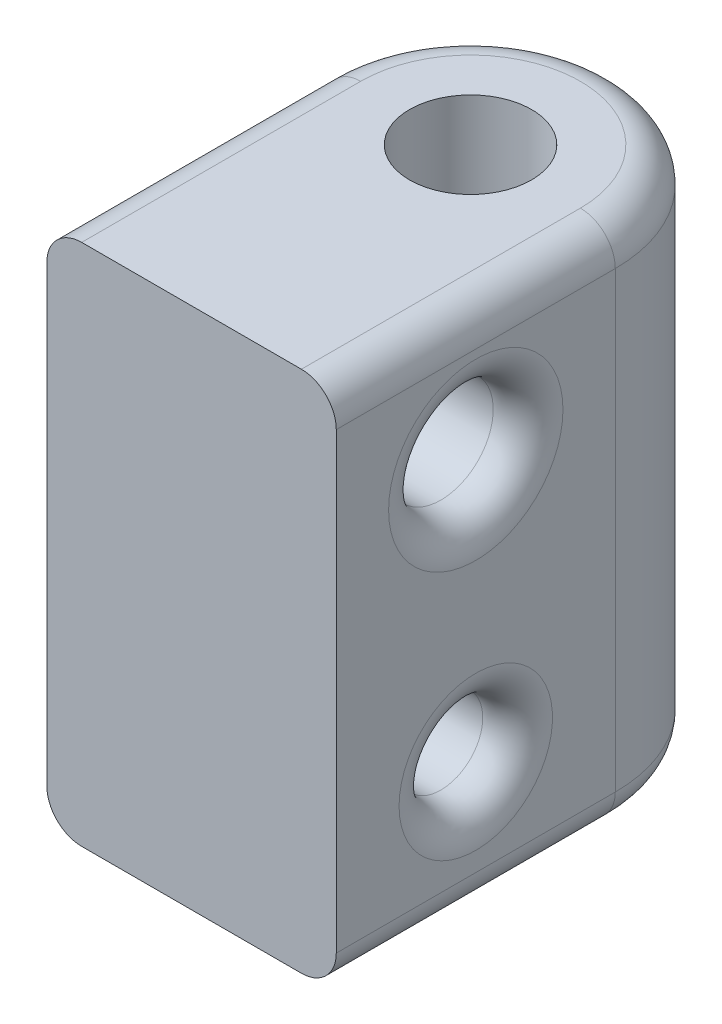
ISO-10303-21;
HEADER;
FILE_DESCRIPTION(('STEP AP214'),'2;1');
FILE_NAME('part.step','',(''),(''),'','','');
FILE_SCHEMA(('AUTOMOTIVE_DESIGN { 1 0 10303 214 1 1 1 1 }'));
ENDSEC;
DATA;
#1=APPLICATION_CONTEXT('core data for automotive mechanical design processes');
#2=APPLICATION_PROTOCOL_DEFINITION('international standard','automotive_design',2000,#1);
#3=PRODUCT_CONTEXT('',#1,'mechanical');
#4=PRODUCT('Part','Part','',(#3));
#5=PRODUCT_RELATED_PRODUCT_CATEGORY('part','',(#4));
#6=PRODUCT_DEFINITION_FORMATION('','',#4);
#7=PRODUCT_DEFINITION_CONTEXT('part definition',#1,'design');
#8=PRODUCT_DEFINITION('design','',#6,#7);
#9=PRODUCT_DEFINITION_SHAPE('','',#8);
#10=(LENGTH_UNIT() NAMED_UNIT(*) SI_UNIT(.MILLI.,.METRE.));
#11=(NAMED_UNIT(*) PLANE_ANGLE_UNIT() SI_UNIT($,.RADIAN.));
#12=(NAMED_UNIT(*) SI_UNIT($,.STERADIAN.) SOLID_ANGLE_UNIT());
#13=UNCERTAINTY_MEASURE_WITH_UNIT(LENGTH_MEASURE(1.E-05),#10,'distance_accuracy_value','');
#14=(GEOMETRIC_REPRESENTATION_CONTEXT(3) GLOBAL_UNCERTAINTY_ASSIGNED_CONTEXT((#13)) GLOBAL_UNIT_ASSIGNED_CONTEXT((#10,
#11,#12)) REPRESENTATION_CONTEXT('',''));
#15=CARTESIAN_POINT('',(0.,0.,0.));
#16=DIRECTION('',(0.,0.,1.));
#17=DIRECTION('',(1.,0.,0.));
#18=AXIS2_PLACEMENT_3D('',#15,#16,#17);
#19=CARTESIAN_POINT('',(0.,7.5,0.));
#20=DIRECTION('',(0.,-1.,0.));
#21=DIRECTION('',(0.,0.,-1.));
#22=AXIS2_PLACEMENT_3D('',#19,#20,#21);
#23=PLANE('',#22);
#24=DIRECTION('',(1.,0.,0.));
#25=VECTOR('',#24,1.);
#26=CARTESIAN_POINT('',(-4.15,7.5,8.));
#27=LINE('',#26,#25);
#28=CARTESIAN_POINT('',(-3.15,7.5,8.));
#29=VERTEX_POINT('',#28);
#30=CARTESIAN_POINT('',(3.15,7.5,8.));
#31=VERTEX_POINT('',#30);
#32=EDGE_CURVE('E107',#29,#31,#27,.T.);
#33=ORIENTED_EDGE('',*,*,#32,.T.);
#34=DIRECTION('',(0.,0.,-1.));
#35=VECTOR('',#34,1.);
#36=CARTESIAN_POINT('',(3.15,7.5,0.));
#37=LINE('',#36,#35);
#38=CARTESIAN_POINT('',(3.15,7.5,0.));
#39=VERTEX_POINT('',#38);
#40=EDGE_CURVE('E115',#31,#39,#37,.T.);
#41=ORIENTED_EDGE('',*,*,#40,.T.);
#42=CARTESIAN_POINT('',(0.,7.5,0.));
#43=DIRECTION('',(0.,-1.,0.));
#44=DIRECTION('',(0.,0.,-1.));
#45=AXIS2_PLACEMENT_3D('',#42,#43,#44);
#46=CIRCLE('',#45,3.15);
#47=CARTESIAN_POINT('',(-3.15,7.5,0.));
#48=VERTEX_POINT('',#47);
#49=EDGE_CURVE('E110',#39,#48,#46,.F.);
#50=ORIENTED_EDGE('',*,*,#49,.T.);
#51=DIRECTION('',(0.,0.,1.));
#52=VECTOR('',#51,1.);
#53=CARTESIAN_POINT('',(-3.15,7.5,0.));
#54=LINE('',#53,#52);
#55=EDGE_CURVE('E103',#48,#29,#54,.T.);
#56=ORIENTED_EDGE('',*,*,#55,.T.);
#57=EDGE_LOOP('',(#33,#41,#50,#56));
#58=FACE_BOUND('',#57,.T.);
#59=CARTESIAN_POINT('',(0.,7.5,0.));
#60=DIRECTION('',(0.,1.,0.));
#61=DIRECTION('',(0.,0.,1.));
#62=AXIS2_PLACEMENT_3D('',#59,#60,#61);
#63=CIRCLE('',#62,1.75);
#64=CARTESIAN_POINT('',(0.,7.5,1.75));
#65=VERTEX_POINT('',#64);
#66=EDGE_CURVE('E220',#65,#65,#63,.T.);
#67=ORIENTED_EDGE('',*,*,#66,.F.);
#68=EDGE_LOOP('',(#67));
#69=FACE_BOUND('',#68,.T.);
#70=ADVANCED_FACE('F37',(#58,#69),#23,.F.);
#71=CARTESIAN_POINT('',(0.,-7.5,0.));
#72=DIRECTION('',(0.,-1.,0.));
#73=DIRECTION('',(0.,0.,-1.));
#74=AXIS2_PLACEMENT_3D('',#71,#72,#73);
#75=PLANE('',#74);
#76=CARTESIAN_POINT('',(0.,-7.5,0.));
#77=DIRECTION('',(0.,-1.,0.));
#78=DIRECTION('',(0.,0.,-1.));
#79=AXIS2_PLACEMENT_3D('',#76,#77,#78);
#80=CIRCLE('',#79,3.15);
#81=CARTESIAN_POINT('',(-3.15,-7.5,0.));
#82=VERTEX_POINT('',#81);
#83=CARTESIAN_POINT('',(3.15,-7.5,0.));
#84=VERTEX_POINT('',#83);
#85=EDGE_CURVE('E54',#82,#84,#80,.T.);
#86=ORIENTED_EDGE('',*,*,#85,.T.);
#87=DIRECTION('',(0.,0.,-1.));
#88=VECTOR('',#87,1.);
#89=CARTESIAN_POINT('',(3.15,-7.5,8.));
#90=LINE('',#89,#88);
#91=CARTESIAN_POINT('',(3.15,-7.5,8.));
#92=VERTEX_POINT('',#91);
#93=EDGE_CURVE('E143',#84,#92,#90,.F.);
#94=ORIENTED_EDGE('',*,*,#93,.T.);
#95=DIRECTION('',(1.,0.,0.));
#96=VECTOR('',#95,1.);
#97=CARTESIAN_POINT('',(-4.15,-7.5,8.));
#98=LINE('',#97,#96);
#99=CARTESIAN_POINT('',(-3.15,-7.5,8.));
#100=VERTEX_POINT('',#99);
#101=EDGE_CURVE('E126',#100,#92,#98,.T.);
#102=ORIENTED_EDGE('',*,*,#101,.F.);
#103=DIRECTION('',(0.,0.,1.));
#104=VECTOR('',#103,1.);
#105=CARTESIAN_POINT('',(-3.15,-7.5,0.));
#106=LINE('',#105,#104);
#107=EDGE_CURVE('E59',#100,#82,#106,.F.);
#108=ORIENTED_EDGE('',*,*,#107,.T.);
#109=EDGE_LOOP('',(#86,#94,#102,#108));
#110=FACE_BOUND('',#109,.T.);
#111=CARTESIAN_POINT('',(0.,-7.5,0.));
#112=DIRECTION('',(0.,1.,0.));
#113=DIRECTION('',(0.,0.,1.));
#114=AXIS2_PLACEMENT_3D('',#111,#112,#113);
#115=CIRCLE('',#114,1.75);
#116=CARTESIAN_POINT('',(0.,-7.5,1.75));
#117=VERTEX_POINT('',#116);
#118=EDGE_CURVE('E149',#117,#117,#115,.T.);
#119=ORIENTED_EDGE('',*,*,#118,.T.);
#120=EDGE_LOOP('',(#119));
#121=FACE_BOUND('',#120,.T.);
#122=ADVANCED_FACE('F230',(#110,#121),#75,.T.);
#123=CARTESIAN_POINT('',(0.,7.5,0.));
#124=DIRECTION('',(0.,-1.,0.));
#125=DIRECTION('',(0.,0.,-1.));
#126=AXIS2_PLACEMENT_3D('',#123,#124,#125);
#127=CYLINDRICAL_SURFACE('',#126,4.15);
#128=DIRECTION('',(0.,-1.,0.));
#129=VECTOR('',#128,1.);
#130=CARTESIAN_POINT('',(-4.15,7.5,0.));
#131=LINE('',#130,#129);
#132=CARTESIAN_POINT('',(-4.15,6.5,0.));
#133=VERTEX_POINT('',#132);
#134=CARTESIAN_POINT('',(-4.15,-6.5,0.));
#135=VERTEX_POINT('',#134);
#136=EDGE_CURVE('E167',#133,#135,#131,.T.);
#137=ORIENTED_EDGE('',*,*,#136,.F.);
#138=CARTESIAN_POINT('',(0.,6.5,0.));
#139=DIRECTION('',(0.,-1.,0.));
#140=DIRECTION('',(0.,0.,-1.));
#141=AXIS2_PLACEMENT_3D('',#138,#139,#140);
#142=CIRCLE('',#141,4.15);
#143=CARTESIAN_POINT('',(4.15,6.5,0.));
#144=VERTEX_POINT('',#143);
#145=EDGE_CURVE('E11',#133,#144,#142,.T.);
#146=ORIENTED_EDGE('',*,*,#145,.T.);
#147=DIRECTION('',(0.,-1.,0.));
#148=VECTOR('',#147,1.);
#149=CARTESIAN_POINT('',(4.15,7.5,0.));
#150=LINE('',#149,#148);
#151=CARTESIAN_POINT('',(4.15,-6.5,0.));
#152=VERTEX_POINT('',#151);
#153=EDGE_CURVE('E125',#144,#152,#150,.T.);
#154=ORIENTED_EDGE('',*,*,#153,.T.);
#155=CARTESIAN_POINT('',(0.,-6.5,0.));
#156=DIRECTION('',(0.,-1.,0.));
#157=DIRECTION('',(0.,0.,-1.));
#158=AXIS2_PLACEMENT_3D('',#155,#156,#157);
#159=CIRCLE('',#158,4.15);
#160=EDGE_CURVE('E46',#152,#135,#159,.F.);
#161=ORIENTED_EDGE('',*,*,#160,.T.);
#162=EDGE_LOOP('',(#137,#146,#154,#161));
#163=FACE_BOUND('',#162,.T.);
#164=ADVANCED_FACE('F218',(#163),#127,.T.);
#165=CARTESIAN_POINT('',(-4.15,7.5,0.));
#166=DIRECTION('',(1.,0.,0.));
#167=DIRECTION('',(0.,0.,-1.));
#168=AXIS2_PLACEMENT_3D('',#165,#166,#167);
#169=PLANE('',#168);
#170=CARTESIAN_POINT('',(-4.15,-3.75,4.));
#171=DIRECTION('',(1.,0.,0.));
#172=DIRECTION('',(0.,0.,-1.));
#173=AXIS2_PLACEMENT_3D('',#170,#171,#172);
#174=CIRCLE('',#173,2.2);
#175=CARTESIAN_POINT('',(-4.15,-3.75,1.8));
#176=VERTEX_POINT('',#175);
#177=EDGE_CURVE('E185',#176,#176,#174,.T.);
#178=ORIENTED_EDGE('',*,*,#177,.T.);
#179=EDGE_LOOP('',(#178));
#180=FACE_BOUND('',#179,.T.);
#181=CARTESIAN_POINT('',(-4.15,3.75,4.));
#182=DIRECTION('',(1.,0.,0.));
#183=DIRECTION('',(0.,0.,-1.));
#184=AXIS2_PLACEMENT_3D('',#181,#182,#183);
#185=CIRCLE('',#184,2.5);
#186=CARTESIAN_POINT('',(-4.15,3.75,1.5));
#187=VERTEX_POINT('',#186);
#188=EDGE_CURVE('E182',#187,#187,#185,.T.);
#189=ORIENTED_EDGE('',*,*,#188,.T.);
#190=EDGE_LOOP('',(#189));
#191=FACE_BOUND('',#190,.T.);
#192=DIRECTION('',(0.,-1.,0.));
#193=VECTOR('',#192,1.);
#194=CARTESIAN_POINT('',(-4.15,7.5,8.));
#195=LINE('',#194,#193);
#196=CARTESIAN_POINT('',(-4.15,6.5,8.));
#197=VERTEX_POINT('',#196);
#198=CARTESIAN_POINT('',(-4.15,-6.5,8.));
#199=VERTEX_POINT('',#198);
#200=EDGE_CURVE('E165',#197,#199,#195,.T.);
#201=ORIENTED_EDGE('',*,*,#200,.F.);
#202=DIRECTION('',(0.,0.,1.));
#203=VECTOR('',#202,1.);
#204=CARTESIAN_POINT('',(-4.15,6.5,0.));
#205=LINE('',#204,#203);
#206=EDGE_CURVE('E130',#197,#133,#205,.F.);
#207=ORIENTED_EDGE('',*,*,#206,.T.);
#208=ORIENTED_EDGE('',*,*,#136,.T.);
#209=DIRECTION('',(0.,0.,1.));
#210=VECTOR('',#209,1.);
#211=CARTESIAN_POINT('',(-4.15,-6.5,8.));
#212=LINE('',#211,#210);
#213=EDGE_CURVE('E133',#135,#199,#212,.T.);
#214=ORIENTED_EDGE('',*,*,#213,.T.);
#215=EDGE_LOOP('',(#201,#207,#208,#214));
#216=FACE_BOUND('',#215,.T.);
#217=ADVANCED_FACE('F164',(#180,#191,#216),#169,.F.);
#218=CARTESIAN_POINT('',(-4.15,7.5,8.));
#219=DIRECTION('',(0.,0.,-1.));
#220=DIRECTION('',(-1.,0.,0.));
#221=AXIS2_PLACEMENT_3D('',#218,#219,#220);
#222=PLANE('',#221);
#223=DIRECTION('',(0.,-1.,0.));
#224=VECTOR('',#223,1.);
#225=CARTESIAN_POINT('',(4.15,7.5,8.));
#226=LINE('',#225,#224);
#227=CARTESIAN_POINT('',(4.15,6.5,8.));
#228=VERTEX_POINT('',#227);
#229=CARTESIAN_POINT('',(4.15,-6.5,8.));
#230=VERTEX_POINT('',#229);
#231=EDGE_CURVE('E169',#228,#230,#226,.T.);
#232=ORIENTED_EDGE('',*,*,#231,.F.);
#233=CARTESIAN_POINT('',(3.15,6.5,8.));
#234=DIRECTION('',(0.,0.,-1.));
#235=DIRECTION('',(-1.,0.,0.));
#236=AXIS2_PLACEMENT_3D('',#233,#234,#235);
#237=CIRCLE('',#236,1.);
#238=EDGE_CURVE('E124',#228,#31,#237,.F.);
#239=ORIENTED_EDGE('',*,*,#238,.T.);
#240=ORIENTED_EDGE('',*,*,#32,.F.);
#241=CARTESIAN_POINT('',(-3.15,6.5,8.));
#242=DIRECTION('',(0.,0.,-1.));
#243=DIRECTION('',(-1.,0.,0.));
#244=AXIS2_PLACEMENT_3D('',#241,#242,#243);
#245=CIRCLE('',#244,1.);
#246=EDGE_CURVE('E121',#29,#197,#245,.F.);
#247=ORIENTED_EDGE('',*,*,#246,.T.);
#248=ORIENTED_EDGE('',*,*,#200,.T.);
#249=CARTESIAN_POINT('',(-3.15,-6.5,8.));
#250=DIRECTION('',(0.,0.,-1.));
#251=DIRECTION('',(-1.,0.,0.));
#252=AXIS2_PLACEMENT_3D('',#249,#250,#251);
#253=CIRCLE('',#252,1.);
#254=EDGE_CURVE('E135',#199,#100,#253,.F.);
#255=ORIENTED_EDGE('',*,*,#254,.T.);
#256=ORIENTED_EDGE('',*,*,#101,.T.);
#257=CARTESIAN_POINT('',(3.15,-6.5,8.));
#258=DIRECTION('',(0.,0.,-1.));
#259=DIRECTION('',(-1.,0.,0.));
#260=AXIS2_PLACEMENT_3D('',#257,#258,#259);
#261=CIRCLE('',#260,1.);
#262=EDGE_CURVE('E131',#92,#230,#261,.F.);
#263=ORIENTED_EDGE('',*,*,#262,.T.);
#264=EDGE_LOOP('',(#232,#239,#240,#247,#248,#255,#256,#263));
#265=FACE_BOUND('',#264,.T.);
#266=ADVANCED_FACE('F119',(#265),#222,.F.);
#267=CARTESIAN_POINT('',(4.15,7.5,8.));
#268=DIRECTION('',(-1.,0.,0.));
#269=DIRECTION('',(0.,0.,1.));
#270=AXIS2_PLACEMENT_3D('',#267,#268,#269);
#271=PLANE('',#270);
#272=CARTESIAN_POINT('',(4.15,-3.75,4.));
#273=DIRECTION('',(-1.,0.,0.));
#274=DIRECTION('',(0.,0.,1.));
#275=AXIS2_PLACEMENT_3D('',#272,#273,#274);
#276=CIRCLE('',#275,2.2);
#277=CARTESIAN_POINT('',(4.15,-3.75,6.2));
#278=VERTEX_POINT('',#277);
#279=EDGE_CURVE('E191',#278,#278,#276,.T.);
#280=ORIENTED_EDGE('',*,*,#279,.T.);
#281=EDGE_LOOP('',(#280));
#282=FACE_BOUND('',#281,.T.);
#283=CARTESIAN_POINT('',(4.15,3.75,4.));
#284=DIRECTION('',(-1.,0.,0.));
#285=DIRECTION('',(0.,0.,1.));
#286=AXIS2_PLACEMENT_3D('',#283,#284,#285);
#287=CIRCLE('',#286,2.5);
#288=CARTESIAN_POINT('',(4.15,3.75,6.5));
#289=VERTEX_POINT('',#288);
#290=EDGE_CURVE('E188',#289,#289,#287,.T.);
#291=ORIENTED_EDGE('',*,*,#290,.T.);
#292=EDGE_LOOP('',(#291));
#293=FACE_BOUND('',#292,.T.);
#294=ORIENTED_EDGE('',*,*,#153,.F.);
#295=DIRECTION('',(0.,0.,-1.));
#296=VECTOR('',#295,1.);
#297=CARTESIAN_POINT('',(4.15,6.5,8.));
#298=LINE('',#297,#296);
#299=EDGE_CURVE('E204',#144,#228,#298,.F.);
#300=ORIENTED_EDGE('',*,*,#299,.T.);
#301=ORIENTED_EDGE('',*,*,#231,.T.);
#302=DIRECTION('',(0.,0.,-1.));
#303=VECTOR('',#302,1.);
#304=CARTESIAN_POINT('',(4.15,-6.5,0.));
#305=LINE('',#304,#303);
#306=EDGE_CURVE('E202',#230,#152,#305,.T.);
#307=ORIENTED_EDGE('',*,*,#306,.T.);
#308=EDGE_LOOP('',(#294,#300,#301,#307));
#309=FACE_BOUND('',#308,.T.);
#310=ADVANCED_FACE('F208',(#282,#293,#309),#271,.F.);
#311=CARTESIAN_POINT('',(0.,7.5,0.));
#312=DIRECTION('',(0.,-1.,0.));
#313=DIRECTION('',(0.,0.,-1.));
#314=AXIS2_PLACEMENT_3D('',#311,#312,#313);
#315=CYLINDRICAL_SURFACE('',#314,1.75);
#316=ORIENTED_EDGE('',*,*,#66,.T.);
#317=EDGE_LOOP('',(#316));
#318=FACE_BOUND('',#317,.T.);
#319=ORIENTED_EDGE('',*,*,#118,.F.);
#320=EDGE_LOOP('',(#319));
#321=FACE_BOUND('',#320,.T.);
#322=ADVANCED_FACE('F227',(#318,#321),#315,.F.);
#323=CARTESIAN_POINT('',(4.15,3.75,4.));
#324=DIRECTION('',(-1.,0.,0.));
#325=DIRECTION('',(0.,0.,1.));
#326=AXIS2_PLACEMENT_3D('',#323,#324,#325);
#327=CYLINDRICAL_SURFACE('',#326,1.5);
#328=CARTESIAN_POINT('',(-3.15,3.75,4.));
#329=DIRECTION('',(1.,0.,0.));
#330=DIRECTION('',(0.,0.,-1.));
#331=AXIS2_PLACEMENT_3D('',#328,#329,#330);
#332=CIRCLE('',#331,1.5);
#333=CARTESIAN_POINT('',(-3.15,3.75,2.5));
#334=VERTEX_POINT('',#333);
#335=EDGE_CURVE('E197',#334,#334,#332,.F.);
#336=ORIENTED_EDGE('',*,*,#335,.T.);
#337=EDGE_LOOP('',(#336));
#338=FACE_BOUND('',#337,.T.);
#339=CARTESIAN_POINT('',(3.15,3.75,4.));
#340=DIRECTION('',(-1.,0.,0.));
#341=DIRECTION('',(0.,0.,1.));
#342=AXIS2_PLACEMENT_3D('',#339,#340,#341);
#343=CIRCLE('',#342,1.5);
#344=CARTESIAN_POINT('',(3.15,3.75,5.5));
#345=VERTEX_POINT('',#344);
#346=EDGE_CURVE('E194',#345,#345,#343,.F.);
#347=ORIENTED_EDGE('',*,*,#346,.T.);
#348=EDGE_LOOP('',(#347));
#349=FACE_BOUND('',#348,.T.);
#350=ADVANCED_FACE('F315',(#338,#349),#327,.F.);
#351=CARTESIAN_POINT('',(4.15,-3.75,4.));
#352=DIRECTION('',(-1.,0.,0.));
#353=DIRECTION('',(0.,0.,1.));
#354=AXIS2_PLACEMENT_3D('',#351,#352,#353);
#355=CYLINDRICAL_SURFACE('',#354,1.2);
#356=CARTESIAN_POINT('',(-3.15,-3.75,4.));
#357=DIRECTION('',(1.,0.,0.));
#358=DIRECTION('',(0.,0.,-1.));
#359=AXIS2_PLACEMENT_3D('',#356,#357,#358);
#360=CIRCLE('',#359,1.2);
#361=CARTESIAN_POINT('',(-3.15,-3.75,2.8));
#362=VERTEX_POINT('',#361);
#363=EDGE_CURVE('E179',#362,#362,#360,.F.);
#364=ORIENTED_EDGE('',*,*,#363,.T.);
#365=EDGE_LOOP('',(#364));
#366=FACE_BOUND('',#365,.T.);
#367=CARTESIAN_POINT('',(3.15,-3.75,4.));
#368=DIRECTION('',(-1.,0.,0.));
#369=DIRECTION('',(0.,0.,1.));
#370=AXIS2_PLACEMENT_3D('',#367,#368,#369);
#371=CIRCLE('',#370,1.2);
#372=CARTESIAN_POINT('',(3.15,-3.75,5.2));
#373=VERTEX_POINT('',#372);
#374=EDGE_CURVE('E171',#373,#373,#371,.F.);
#375=ORIENTED_EDGE('',*,*,#374,.T.);
#376=EDGE_LOOP('',(#375));
#377=FACE_BOUND('',#376,.T.);
#378=ADVANCED_FACE('F253',(#366,#377),#355,.F.);
#379=CARTESIAN_POINT('',(-3.15,-3.75,4.));
#380=DIRECTION('',(1.,0.,0.));
#381=DIRECTION('',(0.,0.,-1.));
#382=AXIS2_PLACEMENT_3D('',#379,#380,#381);
#383=TOROIDAL_SURFACE('',#382,2.2,1.);
#384=ORIENTED_EDGE('',*,*,#177,.F.);
#385=EDGE_LOOP('',(#384));
#386=FACE_BOUND('',#385,.T.);
#387=ORIENTED_EDGE('',*,*,#363,.F.);
#388=EDGE_LOOP('',(#387));
#389=FACE_BOUND('',#388,.T.);
#390=ADVANCED_FACE('F249',(#386,#389),#383,.T.);
#391=CARTESIAN_POINT('',(3.15,-3.75,4.));
#392=DIRECTION('',(-1.,0.,0.));
#393=DIRECTION('',(0.,0.,1.));
#394=AXIS2_PLACEMENT_3D('',#391,#392,#393);
#395=TOROIDAL_SURFACE('',#394,2.2,1.);
#396=ORIENTED_EDGE('',*,*,#374,.F.);
#397=EDGE_LOOP('',(#396));
#398=FACE_BOUND('',#397,.T.);
#399=ORIENTED_EDGE('',*,*,#279,.F.);
#400=EDGE_LOOP('',(#399));
#401=FACE_BOUND('',#400,.T.);
#402=ADVANCED_FACE('F252',(#398,#401),#395,.T.);
#403=CARTESIAN_POINT('',(-3.15,3.75,4.));
#404=DIRECTION('',(1.,0.,0.));
#405=DIRECTION('',(0.,0.,-1.));
#406=AXIS2_PLACEMENT_3D('',#403,#404,#405);
#407=TOROIDAL_SURFACE('',#406,2.5,1.);
#408=ORIENTED_EDGE('',*,*,#188,.F.);
#409=EDGE_LOOP('',(#408));
#410=FACE_BOUND('',#409,.T.);
#411=ORIENTED_EDGE('',*,*,#335,.F.);
#412=EDGE_LOOP('',(#411));
#413=FACE_BOUND('',#412,.T.);
#414=ADVANCED_FACE('F257',(#410,#413),#407,.T.);
#415=CARTESIAN_POINT('',(3.15,3.75,4.));
#416=DIRECTION('',(-1.,0.,0.));
#417=DIRECTION('',(0.,0.,1.));
#418=AXIS2_PLACEMENT_3D('',#415,#416,#417);
#419=TOROIDAL_SURFACE('',#418,2.5,1.);
#420=ORIENTED_EDGE('',*,*,#346,.F.);
#421=EDGE_LOOP('',(#420));
#422=FACE_BOUND('',#421,.T.);
#423=ORIENTED_EDGE('',*,*,#290,.F.);
#424=EDGE_LOOP('',(#423));
#425=FACE_BOUND('',#424,.T.);
#426=ADVANCED_FACE('F261',(#422,#425),#419,.T.);
#427=CARTESIAN_POINT('',(-3.15,6.5,0.));
#428=DIRECTION('',(0.,0.,1.));
#429=DIRECTION('',(1.,0.,0.));
#430=AXIS2_PLACEMENT_3D('',#427,#428,#429);
#431=CYLINDRICAL_SURFACE('',#430,1.);
#432=ORIENTED_EDGE('',*,*,#246,.F.);
#433=ORIENTED_EDGE('',*,*,#55,.F.);
#434=CARTESIAN_POINT('',(-3.15,6.5,0.));
#435=DIRECTION('',(0.,0.,-1.));
#436=DIRECTION('',(-1.,0.,0.));
#437=AXIS2_PLACEMENT_3D('',#434,#435,#436);
#438=CIRCLE('',#437,1.);
#439=EDGE_CURVE('E148',#133,#48,#438,.T.);
#440=ORIENTED_EDGE('',*,*,#439,.F.);
#441=ORIENTED_EDGE('',*,*,#206,.F.);
#442=EDGE_LOOP('',(#432,#433,#440,#441));
#443=FACE_BOUND('',#442,.T.);
#444=ADVANCED_FACE('F129',(#443),#431,.T.);
#445=CARTESIAN_POINT('',(0.,6.5,0.));
#446=DIRECTION('',(0.,-1.,0.));
#447=DIRECTION('',(0.,0.,-1.));
#448=AXIS2_PLACEMENT_3D('',#445,#446,#447);
#449=TOROIDAL_SURFACE('',#448,3.15,1.);
#450=ORIENTED_EDGE('',*,*,#439,.T.);
#451=ORIENTED_EDGE('',*,*,#49,.F.);
#452=CARTESIAN_POINT('',(3.15,6.5,0.));
#453=DIRECTION('',(0.,0.,1.));
#454=DIRECTION('',(1.,0.,0.));
#455=AXIS2_PLACEMENT_3D('',#452,#453,#454);
#456=CIRCLE('',#455,1.);
#457=EDGE_CURVE('E146',#144,#39,#456,.T.);
#458=ORIENTED_EDGE('',*,*,#457,.F.);
#459=ORIENTED_EDGE('',*,*,#145,.F.);
#460=EDGE_LOOP('',(#450,#451,#458,#459));
#461=FACE_BOUND('',#460,.T.);
#462=ADVANCED_FACE('F216',(#461),#449,.T.);
#463=CARTESIAN_POINT('',(3.15,6.5,0.));
#464=DIRECTION('',(0.,0.,-1.));
#465=DIRECTION('',(-1.,0.,0.));
#466=AXIS2_PLACEMENT_3D('',#463,#464,#465);
#467=CYLINDRICAL_SURFACE('',#466,1.);
#468=ORIENTED_EDGE('',*,*,#238,.F.);
#469=ORIENTED_EDGE('',*,*,#299,.F.);
#470=ORIENTED_EDGE('',*,*,#457,.T.);
#471=ORIENTED_EDGE('',*,*,#40,.F.);
#472=EDGE_LOOP('',(#468,#469,#470,#471));
#473=FACE_BOUND('',#472,.T.);
#474=ADVANCED_FACE('F213',(#473),#467,.T.);
#475=CARTESIAN_POINT('',(-3.15,-6.5,0.));
#476=DIRECTION('',(0.,0.,-1.));
#477=DIRECTION('',(-1.,0.,0.));
#478=AXIS2_PLACEMENT_3D('',#475,#476,#477);
#479=CYLINDRICAL_SURFACE('',#478,1.);
#480=ORIENTED_EDGE('',*,*,#254,.F.);
#481=ORIENTED_EDGE('',*,*,#213,.F.);
#482=CARTESIAN_POINT('',(-3.15,-6.5,0.));
#483=DIRECTION('',(0.,0.,-1.));
#484=DIRECTION('',(-1.,0.,0.));
#485=AXIS2_PLACEMENT_3D('',#482,#483,#484);
#486=CIRCLE('',#485,1.);
#487=EDGE_CURVE('E41',#82,#135,#486,.T.);
#488=ORIENTED_EDGE('',*,*,#487,.F.);
#489=ORIENTED_EDGE('',*,*,#107,.F.);
#490=EDGE_LOOP('',(#480,#481,#488,#489));
#491=FACE_BOUND('',#490,.T.);
#492=ADVANCED_FACE('F39',(#491),#479,.T.);
#493=CARTESIAN_POINT('',(0.,-6.5,0.));
#494=DIRECTION('',(0.,-1.,0.));
#495=DIRECTION('',(0.,0.,-1.));
#496=AXIS2_PLACEMENT_3D('',#493,#494,#495);
#497=TOROIDAL_SURFACE('',#496,3.15,1.);
#498=ORIENTED_EDGE('',*,*,#487,.T.);
#499=ORIENTED_EDGE('',*,*,#160,.F.);
#500=CARTESIAN_POINT('',(3.15,-6.5,0.));
#501=DIRECTION('',(0.,0.,1.));
#502=DIRECTION('',(1.,0.,0.));
#503=AXIS2_PLACEMENT_3D('',#500,#501,#502);
#504=CIRCLE('',#503,1.);
#505=EDGE_CURVE('E150',#84,#152,#504,.T.);
#506=ORIENTED_EDGE('',*,*,#505,.F.);
#507=ORIENTED_EDGE('',*,*,#85,.F.);
#508=EDGE_LOOP('',(#498,#499,#506,#507));
#509=FACE_BOUND('',#508,.T.);
#510=ADVANCED_FACE('F157',(#509),#497,.T.);
#511=CARTESIAN_POINT('',(3.15,-6.5,8.));
#512=DIRECTION('',(0.,0.,1.));
#513=DIRECTION('',(1.,0.,0.));
#514=AXIS2_PLACEMENT_3D('',#511,#512,#513);
#515=CYLINDRICAL_SURFACE('',#514,1.);
#516=ORIENTED_EDGE('',*,*,#262,.F.);
#517=ORIENTED_EDGE('',*,*,#93,.F.);
#518=ORIENTED_EDGE('',*,*,#505,.T.);
#519=ORIENTED_EDGE('',*,*,#306,.F.);
#520=EDGE_LOOP('',(#516,#517,#518,#519));
#521=FACE_BOUND('',#520,.T.);
#522=ADVANCED_FACE('F272',(#521),#515,.T.);
#523=CLOSED_SHELL('',(#70,#122,#164,#217,#266,#310,#322,#350,#378,#390,#402,#414,#426,#444,#462,
#474,#492,#510,#522));
#524=MANIFOLD_SOLID_BREP('B2',#523);
#525=ADVANCED_BREP_SHAPE_REPRESENTATION('',(#18,#524),#14);
#526=SHAPE_DEFINITION_REPRESENTATION(#9,#525);
ENDSEC;
END-ISO-10303-21;
